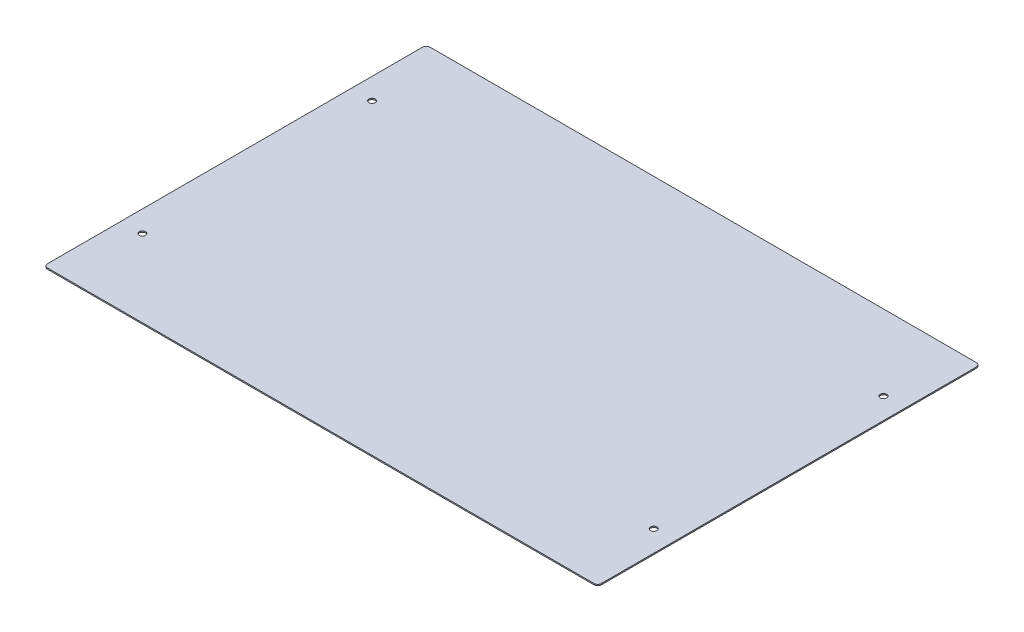
ISO-10303-21;
HEADER;
FILE_DESCRIPTION(('STEP AP214'),'2;1');
FILE_NAME('part.step','',(''),(''),'','','');
FILE_SCHEMA(('AUTOMOTIVE_DESIGN { 1 0 10303 214 1 1 1 1 }'));
ENDSEC;
DATA;
#1=APPLICATION_CONTEXT('core data for automotive mechanical design processes');
#2=APPLICATION_PROTOCOL_DEFINITION('international standard','automotive_design',2000,#1);
#3=PRODUCT_CONTEXT('',#1,'mechanical');
#4=PRODUCT('Part','Part','',(#3));
#5=PRODUCT_RELATED_PRODUCT_CATEGORY('part','',(#4));
#6=PRODUCT_DEFINITION_FORMATION('','',#4);
#7=PRODUCT_DEFINITION_CONTEXT('part definition',#1,'design');
#8=PRODUCT_DEFINITION('design','',#6,#7);
#9=PRODUCT_DEFINITION_SHAPE('','',#8);
#10=(LENGTH_UNIT() NAMED_UNIT(*) SI_UNIT(.MILLI.,.METRE.));
#11=(NAMED_UNIT(*) PLANE_ANGLE_UNIT() SI_UNIT($,.RADIAN.));
#12=(NAMED_UNIT(*) SI_UNIT($,.STERADIAN.) SOLID_ANGLE_UNIT());
#13=UNCERTAINTY_MEASURE_WITH_UNIT(LENGTH_MEASURE(1.E-05),#10,'distance_accuracy_value','');
#14=(GEOMETRIC_REPRESENTATION_CONTEXT(3) GLOBAL_UNCERTAINTY_ASSIGNED_CONTEXT((#13)) GLOBAL_UNIT_ASSIGNED_CONTEXT((#10,
#11,#12)) REPRESENTATION_CONTEXT('',''));
#15=CARTESIAN_POINT('',(0.,0.,0.));
#16=DIRECTION('',(0.,0.,1.));
#17=DIRECTION('',(1.,0.,0.));
#18=AXIS2_PLACEMENT_3D('',#15,#16,#17);
#19=CARTESIAN_POINT('',(-222.75,1.,-152.9));
#20=DIRECTION('',(0.,-1.,0.));
#21=DIRECTION('',(0.,0.,-1.));
#22=AXIS2_PLACEMENT_3D('',#19,#20,#21);
#23=CYLINDRICAL_SURFACE('',#22,3.);
#24=CARTESIAN_POINT('',(-222.75,0.,-152.9));
#25=DIRECTION('',(0.,1.,0.));
#26=DIRECTION('',(0.,0.,-1.));
#27=AXIS2_PLACEMENT_3D('',#24,#25,#26);
#28=CIRCLE('',#27,3.);
#29=CARTESIAN_POINT('',(-222.75,0.,-155.9));
#30=VERTEX_POINT('',#29);
#31=CARTESIAN_POINT('',(-225.75,0.,-152.9));
#32=VERTEX_POINT('',#31);
#33=EDGE_CURVE('E139',#30,#32,#28,.T.);
#34=ORIENTED_EDGE('',*,*,#33,.T.);
#35=DIRECTION('',(0.,-1.,0.));
#36=VECTOR('',#35,1.);
#37=CARTESIAN_POINT('',(-225.75,1.,-152.9));
#38=LINE('',#37,#36);
#39=CARTESIAN_POINT('',(-225.75,1.,-152.9));
#40=VERTEX_POINT('',#39);
#41=EDGE_CURVE('E11',#40,#32,#38,.T.);
#42=ORIENTED_EDGE('',*,*,#41,.F.);
#43=CARTESIAN_POINT('',(-222.75,1.,-152.9));
#44=DIRECTION('',(0.,1.,0.));
#45=DIRECTION('',(0.,0.,-1.));
#46=AXIS2_PLACEMENT_3D('',#43,#44,#45);
#47=CIRCLE('',#46,3.);
#48=CARTESIAN_POINT('',(-222.75,1.,-155.9));
#49=VERTEX_POINT('',#48);
#50=EDGE_CURVE('E157',#49,#40,#47,.T.);
#51=ORIENTED_EDGE('',*,*,#50,.F.);
#52=DIRECTION('',(0.,-1.,0.));
#53=VECTOR('',#52,1.);
#54=CARTESIAN_POINT('',(-222.75,1.,-155.9));
#55=LINE('',#54,#53);
#56=EDGE_CURVE('E135',#49,#30,#55,.T.);
#57=ORIENTED_EDGE('',*,*,#56,.T.);
#58=EDGE_LOOP('',(#34,#42,#51,#57));
#59=FACE_BOUND('',#58,.T.);
#60=ADVANCED_FACE('F43',(#59),#23,.T.);
#61=CARTESIAN_POINT('',(-225.75,1.,152.9));
#62=DIRECTION('',(1.,0.,0.));
#63=DIRECTION('',(0.,0.,-1.));
#64=AXIS2_PLACEMENT_3D('',#61,#62,#63);
#65=PLANE('',#64);
#66=DIRECTION('',(0.,0.,1.));
#67=VECTOR('',#66,1.);
#68=CARTESIAN_POINT('',(-225.75,0.,152.9));
#69=LINE('',#68,#67);
#70=CARTESIAN_POINT('',(-225.75,0.,152.9));
#71=VERTEX_POINT('',#70);
#72=EDGE_CURVE('E142',#32,#71,#69,.T.);
#73=ORIENTED_EDGE('',*,*,#72,.T.);
#74=DIRECTION('',(0.,-1.,0.));
#75=VECTOR('',#74,1.);
#76=CARTESIAN_POINT('',(-225.75,1.,152.9));
#77=LINE('',#76,#75);
#78=CARTESIAN_POINT('',(-225.75,1.,152.9));
#79=VERTEX_POINT('',#78);
#80=EDGE_CURVE('E51',#79,#71,#77,.T.);
#81=ORIENTED_EDGE('',*,*,#80,.F.);
#82=DIRECTION('',(0.,0.,1.));
#83=VECTOR('',#82,1.);
#84=CARTESIAN_POINT('',(-225.75,1.,-133.675));
#85=LINE('',#84,#83);
#86=EDGE_CURVE('E100',#40,#79,#85,.T.);
#87=ORIENTED_EDGE('',*,*,#86,.F.);
#88=ORIENTED_EDGE('',*,*,#41,.T.);
#89=EDGE_LOOP('',(#73,#81,#87,#88));
#90=FACE_BOUND('',#89,.T.);
#91=ADVANCED_FACE('F236',(#90),#65,.F.);
#92=CARTESIAN_POINT('',(-222.75,1.,152.9));
#93=DIRECTION('',(0.,-1.,0.));
#94=DIRECTION('',(0.,0.,-1.));
#95=AXIS2_PLACEMENT_3D('',#92,#93,#94);
#96=CYLINDRICAL_SURFACE('',#95,3.);
#97=CARTESIAN_POINT('',(-222.75,0.,152.9));
#98=DIRECTION('',(0.,1.,0.));
#99=DIRECTION('',(0.,0.,-1.));
#100=AXIS2_PLACEMENT_3D('',#97,#98,#99);
#101=CIRCLE('',#100,3.);
#102=CARTESIAN_POINT('',(-222.75,0.,155.9));
#103=VERTEX_POINT('',#102);
#104=EDGE_CURVE('E145',#71,#103,#101,.T.);
#105=ORIENTED_EDGE('',*,*,#104,.T.);
#106=DIRECTION('',(0.,-1.,0.));
#107=VECTOR('',#106,1.);
#108=CARTESIAN_POINT('',(-222.75,1.,155.9));
#109=LINE('',#108,#107);
#110=CARTESIAN_POINT('',(-222.75,1.,155.9));
#111=VERTEX_POINT('',#110);
#112=EDGE_CURVE('E164',#111,#103,#109,.T.);
#113=ORIENTED_EDGE('',*,*,#112,.F.);
#114=CARTESIAN_POINT('',(-222.75,1.,152.9));
#115=DIRECTION('',(0.,1.,0.));
#116=DIRECTION('',(0.,0.,-1.));
#117=AXIS2_PLACEMENT_3D('',#114,#115,#116);
#118=CIRCLE('',#117,3.);
#119=EDGE_CURVE('E172',#79,#111,#118,.T.);
#120=ORIENTED_EDGE('',*,*,#119,.F.);
#121=ORIENTED_EDGE('',*,*,#80,.T.);
#122=EDGE_LOOP('',(#105,#113,#120,#121));
#123=FACE_BOUND('',#122,.T.);
#124=ADVANCED_FACE('F170',(#123),#96,.T.);
#125=CARTESIAN_POINT('',(222.75,1.,155.9));
#126=DIRECTION('',(0.,0.,-1.));
#127=DIRECTION('',(-1.,0.,0.));
#128=AXIS2_PLACEMENT_3D('',#125,#126,#127);
#129=PLANE('',#128);
#130=DIRECTION('',(1.,0.,0.));
#131=VECTOR('',#130,1.);
#132=CARTESIAN_POINT('',(222.75,0.,155.9));
#133=LINE('',#132,#131);
#134=CARTESIAN_POINT('',(222.75,0.,155.9));
#135=VERTEX_POINT('',#134);
#136=EDGE_CURVE('E148',#103,#135,#133,.T.);
#137=ORIENTED_EDGE('',*,*,#136,.T.);
#138=DIRECTION('',(0.,-1.,0.));
#139=VECTOR('',#138,1.);
#140=CARTESIAN_POINT('',(222.75,1.,155.9));
#141=LINE('',#140,#139);
#142=CARTESIAN_POINT('',(222.75,1.,155.9));
#143=VERTEX_POINT('',#142);
#144=EDGE_CURVE('E161',#143,#135,#141,.T.);
#145=ORIENTED_EDGE('',*,*,#144,.F.);
#146=DIRECTION('',(1.,0.,0.));
#147=VECTOR('',#146,1.);
#148=CARTESIAN_POINT('',(-203.525,1.,155.9));
#149=LINE('',#148,#147);
#150=EDGE_CURVE('E181',#111,#143,#149,.T.);
#151=ORIENTED_EDGE('',*,*,#150,.F.);
#152=ORIENTED_EDGE('',*,*,#112,.T.);
#153=EDGE_LOOP('',(#137,#145,#151,#152));
#154=FACE_BOUND('',#153,.T.);
#155=ADVANCED_FACE('F177',(#154),#129,.F.);
#156=CARTESIAN_POINT('',(222.75,1.,152.9));
#157=DIRECTION('',(0.,-1.,0.));
#158=DIRECTION('',(0.,0.,-1.));
#159=AXIS2_PLACEMENT_3D('',#156,#157,#158);
#160=CYLINDRICAL_SURFACE('',#159,3.);
#161=CARTESIAN_POINT('',(222.75,0.,152.9));
#162=DIRECTION('',(0.,1.,0.));
#163=DIRECTION('',(0.,0.,-1.));
#164=AXIS2_PLACEMENT_3D('',#161,#162,#163);
#165=CIRCLE('',#164,3.);
#166=CARTESIAN_POINT('',(225.75,0.,152.9));
#167=VERTEX_POINT('',#166);
#168=EDGE_CURVE('E150',#135,#167,#165,.T.);
#169=ORIENTED_EDGE('',*,*,#168,.T.);
#170=DIRECTION('',(0.,-1.,0.));
#171=VECTOR('',#170,1.);
#172=CARTESIAN_POINT('',(225.75,1.,152.9));
#173=LINE('',#172,#171);
#174=CARTESIAN_POINT('',(225.75,1.,152.9));
#175=VERTEX_POINT('',#174);
#176=EDGE_CURVE('E130',#175,#167,#173,.T.);
#177=ORIENTED_EDGE('',*,*,#176,.F.);
#178=CARTESIAN_POINT('',(222.75,1.,152.9));
#179=DIRECTION('',(0.,1.,0.));
#180=DIRECTION('',(0.,0.,-1.));
#181=AXIS2_PLACEMENT_3D('',#178,#179,#180);
#182=CIRCLE('',#181,3.);
#183=EDGE_CURVE('E120',#143,#175,#182,.T.);
#184=ORIENTED_EDGE('',*,*,#183,.F.);
#185=ORIENTED_EDGE('',*,*,#144,.T.);
#186=EDGE_LOOP('',(#169,#177,#184,#185));
#187=FACE_BOUND('',#186,.T.);
#188=ADVANCED_FACE('F180',(#187),#160,.T.);
#189=CARTESIAN_POINT('',(225.75,1.,-133.675));
#190=DIRECTION('',(-1.,0.,0.));
#191=DIRECTION('',(0.,0.,1.));
#192=AXIS2_PLACEMENT_3D('',#189,#190,#191);
#193=PLANE('',#192);
#194=DIRECTION('',(0.,0.,-1.));
#195=VECTOR('',#194,1.);
#196=CARTESIAN_POINT('',(225.75,0.,-133.675));
#197=LINE('',#196,#195);
#198=CARTESIAN_POINT('',(225.75,0.,-152.9));
#199=VERTEX_POINT('',#198);
#200=EDGE_CURVE('E128',#167,#199,#197,.T.);
#201=ORIENTED_EDGE('',*,*,#200,.T.);
#202=DIRECTION('',(0.,-1.,0.));
#203=VECTOR('',#202,1.);
#204=CARTESIAN_POINT('',(225.75,1.,-152.9));
#205=LINE('',#204,#203);
#206=CARTESIAN_POINT('',(225.75,1.,-152.9));
#207=VERTEX_POINT('',#206);
#208=EDGE_CURVE('E126',#207,#199,#205,.T.);
#209=ORIENTED_EDGE('',*,*,#208,.F.);
#210=DIRECTION('',(0.,0.,-1.));
#211=VECTOR('',#210,1.);
#212=CARTESIAN_POINT('',(225.75,1.,133.675));
#213=LINE('',#212,#211);
#214=EDGE_CURVE('E113',#175,#207,#213,.T.);
#215=ORIENTED_EDGE('',*,*,#214,.F.);
#216=ORIENTED_EDGE('',*,*,#176,.T.);
#217=EDGE_LOOP('',(#201,#209,#215,#216));
#218=FACE_BOUND('',#217,.T.);
#219=ADVANCED_FACE('F127',(#218),#193,.F.);
#220=CARTESIAN_POINT('',(222.75,1.,-152.9));
#221=DIRECTION('',(0.,-1.,0.));
#222=DIRECTION('',(0.,0.,-1.));
#223=AXIS2_PLACEMENT_3D('',#220,#221,#222);
#224=CYLINDRICAL_SURFACE('',#223,3.);
#225=CARTESIAN_POINT('',(222.75,0.,-152.9));
#226=DIRECTION('',(0.,1.,0.));
#227=DIRECTION('',(0.,0.,1.));
#228=AXIS2_PLACEMENT_3D('',#225,#226,#227);
#229=CIRCLE('',#228,3.);
#230=CARTESIAN_POINT('',(222.75,0.,-155.9));
#231=VERTEX_POINT('',#230);
#232=EDGE_CURVE('E154',#199,#231,#229,.T.);
#233=ORIENTED_EDGE('',*,*,#232,.T.);
#234=DIRECTION('',(0.,-1.,0.));
#235=VECTOR('',#234,1.);
#236=CARTESIAN_POINT('',(222.75,1.,-155.9));
#237=LINE('',#236,#235);
#238=CARTESIAN_POINT('',(222.75,1.,-155.9));
#239=VERTEX_POINT('',#238);
#240=EDGE_CURVE('E131',#239,#231,#237,.T.);
#241=ORIENTED_EDGE('',*,*,#240,.F.);
#242=CARTESIAN_POINT('',(222.75,1.,-152.9));
#243=DIRECTION('',(0.,1.,0.));
#244=DIRECTION('',(0.,0.,1.));
#245=AXIS2_PLACEMENT_3D('',#242,#243,#244);
#246=CIRCLE('',#245,3.);
#247=EDGE_CURVE('E117',#207,#239,#246,.T.);
#248=ORIENTED_EDGE('',*,*,#247,.F.);
#249=ORIENTED_EDGE('',*,*,#208,.T.);
#250=EDGE_LOOP('',(#233,#241,#248,#249));
#251=FACE_BOUND('',#250,.T.);
#252=ADVANCED_FACE('F133',(#251),#224,.T.);
#253=CARTESIAN_POINT('',(-222.75,1.,-155.9));
#254=DIRECTION('',(0.,0.,1.));
#255=DIRECTION('',(1.,0.,0.));
#256=AXIS2_PLACEMENT_3D('',#253,#254,#255);
#257=PLANE('',#256);
#258=DIRECTION('',(-1.,0.,0.));
#259=VECTOR('',#258,1.);
#260=CARTESIAN_POINT('',(-222.75,0.,-155.9));
#261=LINE('',#260,#259);
#262=EDGE_CURVE('E88',#231,#30,#261,.T.);
#263=ORIENTED_EDGE('',*,*,#262,.T.);
#264=ORIENTED_EDGE('',*,*,#56,.F.);
#265=DIRECTION('',(-1.,0.,0.));
#266=VECTOR('',#265,1.);
#267=CARTESIAN_POINT('',(222.75,1.,-155.9));
#268=LINE('',#267,#266);
#269=EDGE_CURVE('E59',#239,#49,#268,.T.);
#270=ORIENTED_EDGE('',*,*,#269,.F.);
#271=ORIENTED_EDGE('',*,*,#240,.T.);
#272=EDGE_LOOP('',(#263,#264,#270,#271));
#273=FACE_BOUND('',#272,.T.);
#274=ADVANCED_FACE('F215',(#273),#257,.F.);
#275=CARTESIAN_POINT('',(-222.75,1.,-152.9));
#276=DIRECTION('',(0.,-1.,0.));
#277=DIRECTION('',(0.,0.,-1.));
#278=AXIS2_PLACEMENT_3D('',#275,#276,#277);
#279=PLANE('',#278);
#280=CARTESIAN_POINT('',(-208.44992,1.,92.8990000000003));
#281=DIRECTION('',(0.,1.,0.));
#282=DIRECTION('',(0.,0.,1.));
#283=AXIS2_PLACEMENT_3D('',#280,#281,#282);
#284=CIRCLE('',#283,2.59999999999999);
#285=CARTESIAN_POINT('',(-208.44992,1.,95.4990000000003));
#286=VERTEX_POINT('',#285);
#287=EDGE_CURVE('E190',#286,#286,#284,.T.);
#288=ORIENTED_EDGE('',*,*,#287,.F.);
#289=EDGE_LOOP('',(#288));
#290=FACE_BOUND('',#289,.T.);
#291=CARTESIAN_POINT('',(208.449920000004,1.,-94.3990000000002));
#292=DIRECTION('',(0.,1.,0.));
#293=DIRECTION('',(0.,0.,-1.));
#294=AXIS2_PLACEMENT_3D('',#291,#292,#293);
#295=CIRCLE('',#294,2.59999999999999);
#296=CARTESIAN_POINT('',(208.449920000004,1.,-96.9990000000002));
#297=VERTEX_POINT('',#296);
#298=EDGE_CURVE('E196',#297,#297,#295,.T.);
#299=ORIENTED_EDGE('',*,*,#298,.F.);
#300=EDGE_LOOP('',(#299));
#301=FACE_BOUND('',#300,.T.);
#302=CARTESIAN_POINT('',(208.449920000008,1.,92.8990000000003));
#303=DIRECTION('',(0.,1.,0.));
#304=DIRECTION('',(0.,0.,1.));
#305=AXIS2_PLACEMENT_3D('',#302,#303,#304);
#306=CIRCLE('',#305,2.59999999999999);
#307=CARTESIAN_POINT('',(208.449920000008,1.,95.4990000000003));
#308=VERTEX_POINT('',#307);
#309=EDGE_CURVE('E197',#308,#308,#306,.T.);
#310=ORIENTED_EDGE('',*,*,#309,.F.);
#311=EDGE_LOOP('',(#310));
#312=FACE_BOUND('',#311,.T.);
#313=CARTESIAN_POINT('',(-208.449920000004,1.,-94.3990000000001));
#314=DIRECTION('',(0.,1.,0.));
#315=DIRECTION('',(0.,0.,1.));
#316=AXIS2_PLACEMENT_3D('',#313,#314,#315);
#317=CIRCLE('',#316,2.59999999999964);
#318=CARTESIAN_POINT('',(-208.449920000004,1.,-91.7990000000005));
#319=VERTEX_POINT('',#318);
#320=EDGE_CURVE('E187',#319,#319,#317,.T.);
#321=ORIENTED_EDGE('',*,*,#320,.F.);
#322=EDGE_LOOP('',(#321));
#323=FACE_BOUND('',#322,.T.);
#324=ORIENTED_EDGE('',*,*,#50,.T.);
#325=ORIENTED_EDGE('',*,*,#86,.T.);
#326=ORIENTED_EDGE('',*,*,#119,.T.);
#327=ORIENTED_EDGE('',*,*,#150,.T.);
#328=ORIENTED_EDGE('',*,*,#183,.T.);
#329=ORIENTED_EDGE('',*,*,#214,.T.);
#330=ORIENTED_EDGE('',*,*,#247,.T.);
#331=ORIENTED_EDGE('',*,*,#269,.T.);
#332=EDGE_LOOP('',(#324,#325,#326,#327,#328,#329,#330,#331));
#333=FACE_BOUND('',#332,.T.);
#334=ADVANCED_FACE('F115',(#290,#301,#312,#323,#333),#279,.F.);
#335=CARTESIAN_POINT('',(-222.75,0.,-152.9));
#336=DIRECTION('',(0.,-1.,0.));
#337=DIRECTION('',(0.,0.,-1.));
#338=AXIS2_PLACEMENT_3D('',#335,#336,#337);
#339=PLANE('',#338);
#340=CARTESIAN_POINT('',(-208.44992,0.,92.8990000000003));
#341=DIRECTION('',(0.,1.,0.));
#342=DIRECTION('',(0.,0.,1.));
#343=AXIS2_PLACEMENT_3D('',#340,#341,#342);
#344=CIRCLE('',#343,2.59999999999999);
#345=CARTESIAN_POINT('',(-208.44992,0.,95.4990000000003));
#346=VERTEX_POINT('',#345);
#347=EDGE_CURVE('E200',#346,#346,#344,.T.);
#348=ORIENTED_EDGE('',*,*,#347,.T.);
#349=EDGE_LOOP('',(#348));
#350=FACE_BOUND('',#349,.T.);
#351=CARTESIAN_POINT('',(208.449920000004,0.,-94.3990000000002));
#352=DIRECTION('',(0.,1.,0.));
#353=DIRECTION('',(0.,0.,-1.));
#354=AXIS2_PLACEMENT_3D('',#351,#352,#353);
#355=CIRCLE('',#354,2.59999999999999);
#356=CARTESIAN_POINT('',(208.449920000004,0.,-96.9990000000002));
#357=VERTEX_POINT('',#356);
#358=EDGE_CURVE('E193',#357,#357,#355,.T.);
#359=ORIENTED_EDGE('',*,*,#358,.T.);
#360=EDGE_LOOP('',(#359));
#361=FACE_BOUND('',#360,.T.);
#362=CARTESIAN_POINT('',(208.449920000008,0.,92.8990000000003));
#363=DIRECTION('',(0.,1.,0.));
#364=DIRECTION('',(0.,0.,1.));
#365=AXIS2_PLACEMENT_3D('',#362,#363,#364);
#366=CIRCLE('',#365,2.59999999999999);
#367=CARTESIAN_POINT('',(208.449920000008,0.,95.4990000000003));
#368=VERTEX_POINT('',#367);
#369=EDGE_CURVE('E205',#368,#368,#366,.T.);
#370=ORIENTED_EDGE('',*,*,#369,.T.);
#371=EDGE_LOOP('',(#370));
#372=FACE_BOUND('',#371,.T.);
#373=CARTESIAN_POINT('',(-208.449920000004,0.,-94.3990000000001));
#374=DIRECTION('',(0.,1.,0.));
#375=DIRECTION('',(0.,0.,1.));
#376=AXIS2_PLACEMENT_3D('',#373,#374,#375);
#377=CIRCLE('',#376,2.59999999999964);
#378=CARTESIAN_POINT('',(-208.449920000004,0.,-91.7990000000005));
#379=VERTEX_POINT('',#378);
#380=EDGE_CURVE('E143',#379,#379,#377,.T.);
#381=ORIENTED_EDGE('',*,*,#380,.T.);
#382=EDGE_LOOP('',(#381));
#383=FACE_BOUND('',#382,.T.);
#384=ORIENTED_EDGE('',*,*,#33,.F.);
#385=ORIENTED_EDGE('',*,*,#262,.F.);
#386=ORIENTED_EDGE('',*,*,#232,.F.);
#387=ORIENTED_EDGE('',*,*,#200,.F.);
#388=ORIENTED_EDGE('',*,*,#168,.F.);
#389=ORIENTED_EDGE('',*,*,#136,.F.);
#390=ORIENTED_EDGE('',*,*,#104,.F.);
#391=ORIENTED_EDGE('',*,*,#72,.F.);
#392=EDGE_LOOP('',(#384,#385,#386,#387,#388,#389,#390,#391));
#393=FACE_BOUND('',#392,.T.);
#394=ADVANCED_FACE('F173',(#350,#361,#372,#383,#393),#339,.T.);
#395=CARTESIAN_POINT('',(-208.449920000004,0.,-94.3990000000001));
#396=DIRECTION('',(0.,1.,0.));
#397=DIRECTION('',(0.,0.,1.));
#398=AXIS2_PLACEMENT_3D('',#395,#396,#397);
#399=CYLINDRICAL_SURFACE('',#398,2.59999999999964);
#400=ORIENTED_EDGE('',*,*,#380,.F.);
#401=EDGE_LOOP('',(#400));
#402=FACE_BOUND('',#401,.T.);
#403=ORIENTED_EDGE('',*,*,#320,.T.);
#404=EDGE_LOOP('',(#403));
#405=FACE_BOUND('',#404,.T.);
#406=ADVANCED_FACE('F220',(#402,#405),#399,.F.);
#407=CARTESIAN_POINT('',(208.449920000008,0.,92.8990000000003));
#408=DIRECTION('',(0.,1.,0.));
#409=DIRECTION('',(0.,0.,1.));
#410=AXIS2_PLACEMENT_3D('',#407,#408,#409);
#411=CYLINDRICAL_SURFACE('',#410,2.59999999999999);
#412=ORIENTED_EDGE('',*,*,#369,.F.);
#413=EDGE_LOOP('',(#412));
#414=FACE_BOUND('',#413,.T.);
#415=ORIENTED_EDGE('',*,*,#309,.T.);
#416=EDGE_LOOP('',(#415));
#417=FACE_BOUND('',#416,.T.);
#418=ADVANCED_FACE('F211',(#414,#417),#411,.F.);
#419=CARTESIAN_POINT('',(208.449920000004,0.,-94.3990000000002));
#420=DIRECTION('',(0.,1.,0.));
#421=DIRECTION('',(0.,0.,1.));
#422=AXIS2_PLACEMENT_3D('',#419,#420,#421);
#423=CYLINDRICAL_SURFACE('',#422,2.59999999999999);
#424=ORIENTED_EDGE('',*,*,#358,.F.);
#425=EDGE_LOOP('',(#424));
#426=FACE_BOUND('',#425,.T.);
#427=ORIENTED_EDGE('',*,*,#298,.T.);
#428=EDGE_LOOP('',(#427));
#429=FACE_BOUND('',#428,.T.);
#430=ADVANCED_FACE('F228',(#426,#429),#423,.F.);
#431=CARTESIAN_POINT('',(-208.44992,0.,92.8990000000003));
#432=DIRECTION('',(0.,1.,0.));
#433=DIRECTION('',(0.,0.,1.));
#434=AXIS2_PLACEMENT_3D('',#431,#432,#433);
#435=CYLINDRICAL_SURFACE('',#434,2.59999999999999);
#436=ORIENTED_EDGE('',*,*,#347,.F.);
#437=EDGE_LOOP('',(#436));
#438=FACE_BOUND('',#437,.T.);
#439=ORIENTED_EDGE('',*,*,#287,.T.);
#440=EDGE_LOOP('',(#439));
#441=FACE_BOUND('',#440,.T.);
#442=ADVANCED_FACE('F326',(#438,#441),#435,.F.);
#443=CLOSED_SHELL('',(#60,#91,#124,#155,#188,#219,#252,#274,#334,#394,#406,#418,#430,#442));
#444=MANIFOLD_SOLID_BREP('B2',#443);
#445=ADVANCED_BREP_SHAPE_REPRESENTATION('',(#18,#444),#14);
#446=SHAPE_DEFINITION_REPRESENTATION(#9,#445);
ENDSEC;
END-ISO-10303-21;
